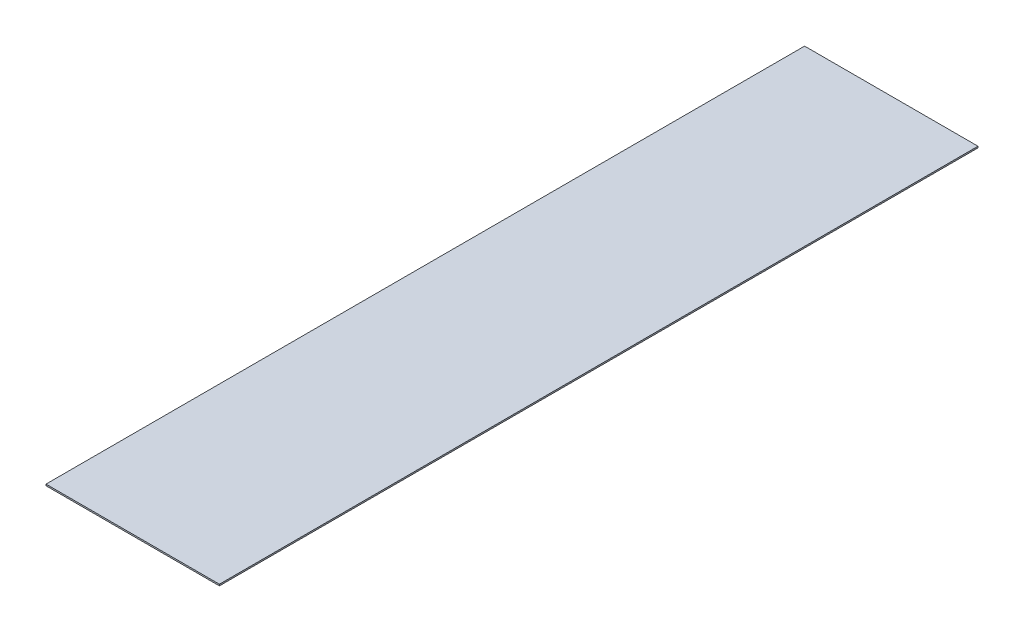
ISO-10303-21;
HEADER;
FILE_DESCRIPTION(('STEP AP214'),'2;1');
FILE_NAME('part.step','',(''),(''),'','','');
FILE_SCHEMA(('AUTOMOTIVE_DESIGN { 1 0 10303 214 1 1 1 1 }'));
ENDSEC;
DATA;
#1=APPLICATION_CONTEXT('core data for automotive mechanical design processes');
#2=APPLICATION_PROTOCOL_DEFINITION('international standard','automotive_design',2000,#1);
#3=PRODUCT_CONTEXT('',#1,'mechanical');
#4=PRODUCT('Part','Part','',(#3));
#5=PRODUCT_RELATED_PRODUCT_CATEGORY('part','',(#4));
#6=PRODUCT_DEFINITION_FORMATION('','',#4);
#7=PRODUCT_DEFINITION_CONTEXT('part definition',#1,'design');
#8=PRODUCT_DEFINITION('design','',#6,#7);
#9=PRODUCT_DEFINITION_SHAPE('','',#8);
#10=(LENGTH_UNIT() NAMED_UNIT(*) SI_UNIT(.MILLI.,.METRE.));
#11=(NAMED_UNIT(*) PLANE_ANGLE_UNIT() SI_UNIT($,.RADIAN.));
#12=(NAMED_UNIT(*) SI_UNIT($,.STERADIAN.) SOLID_ANGLE_UNIT());
#13=UNCERTAINTY_MEASURE_WITH_UNIT(LENGTH_MEASURE(1.E-05),#10,'distance_accuracy_value','');
#14=(GEOMETRIC_REPRESENTATION_CONTEXT(3) GLOBAL_UNCERTAINTY_ASSIGNED_CONTEXT((#13)) GLOBAL_UNIT_ASSIGNED_CONTEXT((#10,
#11,#12)) REPRESENTATION_CONTEXT('',''));
#15=CARTESIAN_POINT('',(0.,0.,0.));
#16=DIRECTION('',(0.,0.,1.));
#17=DIRECTION('',(1.,0.,0.));
#18=AXIS2_PLACEMENT_3D('',#15,#16,#17);
#19=CARTESIAN_POINT('',(0.,3.4163,0.));
#20=DIRECTION('',(1.,0.,0.));
#21=DIRECTION('',(0.,0.,-1.));
#22=AXIS2_PLACEMENT_3D('',#19,#20,#21);
#23=PLANE('',#22);
#24=DIRECTION('',(0.,0.,1.));
#25=VECTOR('',#24,1.);
#26=CARTESIAN_POINT('',(0.,0.,0.));
#27=LINE('',#26,#25);
#28=CARTESIAN_POINT('',(0.,0.,-1750.));
#29=VERTEX_POINT('',#28);
#30=CARTESIAN_POINT('',(0.,0.,0.));
#31=VERTEX_POINT('',#30);
#32=EDGE_CURVE('E97',#29,#31,#27,.T.);
#33=ORIENTED_EDGE('',*,*,#32,.T.);
#34=DIRECTION('',(0.,-1.,0.));
#35=VECTOR('',#34,1.);
#36=CARTESIAN_POINT('',(0.,3.4163,0.));
#37=LINE('',#36,#35);
#38=CARTESIAN_POINT('',(0.,3.4163,0.));
#39=VERTEX_POINT('',#38);
#40=EDGE_CURVE('E11',#39,#31,#37,.T.);
#41=ORIENTED_EDGE('',*,*,#40,.F.);
#42=DIRECTION('',(0.,0.,1.));
#43=VECTOR('',#42,1.);
#44=CARTESIAN_POINT('',(0.,3.4163,0.));
#45=LINE('',#44,#43);
#46=CARTESIAN_POINT('',(0.,3.4163,-1750.));
#47=VERTEX_POINT('',#46);
#48=EDGE_CURVE('E85',#47,#39,#45,.T.);
#49=ORIENTED_EDGE('',*,*,#48,.F.);
#50=DIRECTION('',(0.,-1.,0.));
#51=VECTOR('',#50,1.);
#52=CARTESIAN_POINT('',(0.,3.4163,-1750.));
#53=LINE('',#52,#51);
#54=EDGE_CURVE('E93',#47,#29,#53,.T.);
#55=ORIENTED_EDGE('',*,*,#54,.T.);
#56=EDGE_LOOP('',(#33,#41,#49,#55));
#57=FACE_BOUND('',#56,.T.);
#58=ADVANCED_FACE('F34',(#57),#23,.F.);
#59=CARTESIAN_POINT('',(0.,3.4163,0.));
#60=DIRECTION('',(0.,0.,-1.));
#61=DIRECTION('',(-1.,0.,0.));
#62=AXIS2_PLACEMENT_3D('',#59,#60,#61);
#63=PLANE('',#62);
#64=DIRECTION('',(1.,0.,0.));
#65=VECTOR('',#64,1.);
#66=CARTESIAN_POINT('',(0.,0.,0.));
#67=LINE('',#66,#65);
#68=CARTESIAN_POINT('',(400.,0.,0.));
#69=VERTEX_POINT('',#68);
#70=EDGE_CURVE('E89',#31,#69,#67,.T.);
#71=ORIENTED_EDGE('',*,*,#70,.T.);
#72=DIRECTION('',(0.,-1.,0.));
#73=VECTOR('',#72,1.);
#74=CARTESIAN_POINT('',(400.,3.4163,0.));
#75=LINE('',#74,#73);
#76=CARTESIAN_POINT('',(400.,3.4163,0.));
#77=VERTEX_POINT('',#76);
#78=EDGE_CURVE('E42',#77,#69,#75,.T.);
#79=ORIENTED_EDGE('',*,*,#78,.F.);
#80=DIRECTION('',(1.,0.,0.));
#81=VECTOR('',#80,1.);
#82=CARTESIAN_POINT('',(0.,3.4163,0.));
#83=LINE('',#82,#81);
#84=EDGE_CURVE('E80',#39,#77,#83,.T.);
#85=ORIENTED_EDGE('',*,*,#84,.F.);
#86=ORIENTED_EDGE('',*,*,#40,.T.);
#87=EDGE_LOOP('',(#71,#79,#85,#86));
#88=FACE_BOUND('',#87,.T.);
#89=ADVANCED_FACE('F88',(#88),#63,.F.);
#90=CARTESIAN_POINT('',(400.,3.4163,0.));
#91=DIRECTION('',(-1.,0.,0.));
#92=DIRECTION('',(0.,0.,1.));
#93=AXIS2_PLACEMENT_3D('',#90,#91,#92);
#94=PLANE('',#93);
#95=DIRECTION('',(0.,0.,-1.));
#96=VECTOR('',#95,1.);
#97=CARTESIAN_POINT('',(400.,0.,0.));
#98=LINE('',#97,#96);
#99=CARTESIAN_POINT('',(400.,0.,-1750.));
#100=VERTEX_POINT('',#99);
#101=EDGE_CURVE('E67',#69,#100,#98,.T.);
#102=ORIENTED_EDGE('',*,*,#101,.T.);
#103=DIRECTION('',(0.,-1.,0.));
#104=VECTOR('',#103,1.);
#105=CARTESIAN_POINT('',(400.,3.4163,-1750.));
#106=LINE('',#105,#104);
#107=CARTESIAN_POINT('',(400.,3.4163,-1750.));
#108=VERTEX_POINT('',#107);
#109=EDGE_CURVE('E90',#108,#100,#106,.T.);
#110=ORIENTED_EDGE('',*,*,#109,.F.);
#111=DIRECTION('',(0.,0.,-1.));
#112=VECTOR('',#111,1.);
#113=CARTESIAN_POINT('',(400.,3.4163,0.));
#114=LINE('',#113,#112);
#115=EDGE_CURVE('E83',#77,#108,#114,.T.);
#116=ORIENTED_EDGE('',*,*,#115,.F.);
#117=ORIENTED_EDGE('',*,*,#78,.T.);
#118=EDGE_LOOP('',(#102,#110,#116,#117));
#119=FACE_BOUND('',#118,.T.);
#120=ADVANCED_FACE('F91',(#119),#94,.F.);
#121=CARTESIAN_POINT('',(0.,3.4163,-1750.));
#122=DIRECTION('',(0.,0.,1.));
#123=DIRECTION('',(1.,0.,0.));
#124=AXIS2_PLACEMENT_3D('',#121,#122,#123);
#125=PLANE('',#124);
#126=DIRECTION('',(-1.,0.,0.));
#127=VECTOR('',#126,1.);
#128=CARTESIAN_POINT('',(0.,0.,-1750.));
#129=LINE('',#128,#127);
#130=EDGE_CURVE('E73',#100,#29,#129,.T.);
#131=ORIENTED_EDGE('',*,*,#130,.T.);
#132=ORIENTED_EDGE('',*,*,#54,.F.);
#133=DIRECTION('',(-1.,0.,0.));
#134=VECTOR('',#133,1.);
#135=CARTESIAN_POINT('',(0.,3.4163,-1750.));
#136=LINE('',#135,#134);
#137=EDGE_CURVE('E50',#108,#47,#136,.T.);
#138=ORIENTED_EDGE('',*,*,#137,.F.);
#139=ORIENTED_EDGE('',*,*,#109,.T.);
#140=EDGE_LOOP('',(#131,#132,#138,#139));
#141=FACE_BOUND('',#140,.T.);
#142=ADVANCED_FACE('F104',(#141),#125,.F.);
#143=CARTESIAN_POINT('',(0.,3.4163,0.));
#144=DIRECTION('',(0.,-1.,0.));
#145=DIRECTION('',(0.,0.,-1.));
#146=AXIS2_PLACEMENT_3D('',#143,#144,#145);
#147=PLANE('',#146);
#148=ORIENTED_EDGE('',*,*,#48,.T.);
#149=ORIENTED_EDGE('',*,*,#84,.T.);
#150=ORIENTED_EDGE('',*,*,#115,.T.);
#151=ORIENTED_EDGE('',*,*,#137,.T.);
#152=EDGE_LOOP('',(#148,#149,#150,#151));
#153=FACE_BOUND('',#152,.T.);
#154=ADVANCED_FACE('F81',(#153),#147,.F.);
#155=CARTESIAN_POINT('',(0.,0.,0.));
#156=DIRECTION('',(0.,-1.,0.));
#157=DIRECTION('',(0.,0.,-1.));
#158=AXIS2_PLACEMENT_3D('',#155,#156,#157);
#159=PLANE('',#158);
#160=ORIENTED_EDGE('',*,*,#32,.F.);
#161=ORIENTED_EDGE('',*,*,#130,.F.);
#162=ORIENTED_EDGE('',*,*,#101,.F.);
#163=ORIENTED_EDGE('',*,*,#70,.F.);
#164=EDGE_LOOP('',(#160,#161,#162,#163));
#165=FACE_BOUND('',#164,.T.);
#166=ADVANCED_FACE('F107',(#165),#159,.T.);
#167=CLOSED_SHELL('',(#58,#89,#120,#142,#154,#166));
#168=MANIFOLD_SOLID_BREP('B2',#167);
#169=ADVANCED_BREP_SHAPE_REPRESENTATION('',(#18,#168),#14);
#170=SHAPE_DEFINITION_REPRESENTATION(#9,#169);
ENDSEC;
END-ISO-10303-21;
